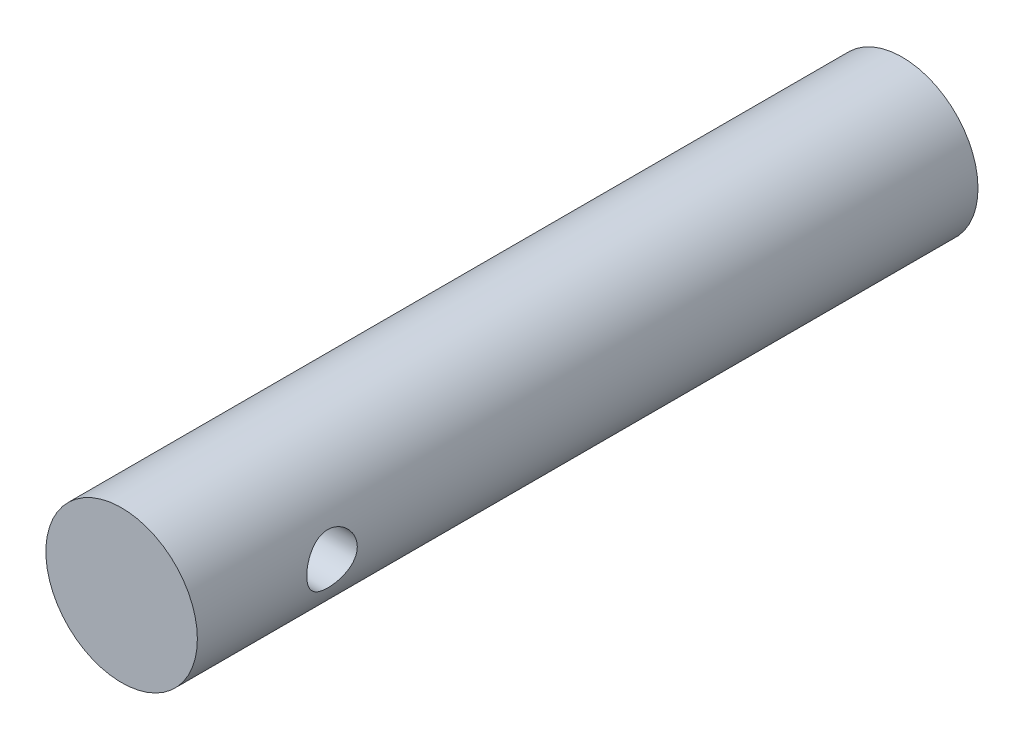
ISO-10303-21;
HEADER;
FILE_DESCRIPTION(('STEP AP214'),'2;1');
FILE_NAME('part.step','',(''),(''),'','','');
FILE_SCHEMA(('AUTOMOTIVE_DESIGN { 1 0 10303 214 1 1 1 1 }'));
ENDSEC;
DATA;
#1=APPLICATION_CONTEXT('core data for automotive mechanical design processes');
#2=APPLICATION_PROTOCOL_DEFINITION('international standard','automotive_design',2000,#1);
#3=PRODUCT_CONTEXT('',#1,'mechanical');
#4=PRODUCT('Part','Part','',(#3));
#5=PRODUCT_RELATED_PRODUCT_CATEGORY('part','',(#4));
#6=PRODUCT_DEFINITION_FORMATION('','',#4);
#7=PRODUCT_DEFINITION_CONTEXT('part definition',#1,'design');
#8=PRODUCT_DEFINITION('design','',#6,#7);
#9=PRODUCT_DEFINITION_SHAPE('','',#8);
#10=(LENGTH_UNIT() NAMED_UNIT(*) SI_UNIT(.MILLI.,.METRE.));
#11=(NAMED_UNIT(*) PLANE_ANGLE_UNIT() SI_UNIT($,.RADIAN.));
#12=(NAMED_UNIT(*) SI_UNIT($,.STERADIAN.) SOLID_ANGLE_UNIT());
#13=UNCERTAINTY_MEASURE_WITH_UNIT(LENGTH_MEASURE(1.E-05),#10,'distance_accuracy_value','');
#14=(GEOMETRIC_REPRESENTATION_CONTEXT(3) GLOBAL_UNCERTAINTY_ASSIGNED_CONTEXT((#13)) GLOBAL_UNIT_ASSIGNED_CONTEXT((#10,
#11,#12)) REPRESENTATION_CONTEXT('',''));
#15=CARTESIAN_POINT('',(0.,0.,0.));
#16=DIRECTION('',(0.,0.,1.));
#17=DIRECTION('',(1.,0.,0.));
#18=AXIS2_PLACEMENT_3D('',#15,#16,#17);
#19=CARTESIAN_POINT('',(0.,0.,-58.890916));
#20=DIRECTION('',(0.,0.,1.));
#21=DIRECTION('',(1.,0.,0.));
#22=AXIS2_PLACEMENT_3D('',#19,#20,#21);
#23=CYLINDRICAL_SURFACE('',#22,5.715);
#24=CARTESIAN_POINT('',(-5.715,0.,-12.065));
#25=CARTESIAN_POINT('',(-5.71500029148298,-0.103943206299207,-12.0650004833588));
#26=CARTESIAN_POINT('',(-5.71213810911873,-0.207883495595937,-12.0564650930276));
#27=CARTESIAN_POINT('',(-5.7010022543725,-0.412702554463011,-12.0226535477032));
#28=CARTESIAN_POINT('',(-5.69272802020101,-0.513581005066346,-11.9973756547773));
#29=CARTESIAN_POINT('',(-5.67166711561773,-0.709293964000881,-11.9310418413534));
#30=CARTESIAN_POINT('',(-5.65888799127276,-0.804138268312893,-11.8900122960151));
#31=CARTESIAN_POINT('',(-5.63012169091536,-0.98559925461414,-11.7934590657429));
#32=CARTESIAN_POINT('',(-5.61413388222117,-1.07221430900633,-11.73793252167));
#33=CARTESIAN_POINT('',(-5.58001349913925,-1.23775789091741,-11.6119418417441));
#34=CARTESIAN_POINT('',(-5.5618295506351,-1.31636204906827,-11.5410654987338));
#35=CARTESIAN_POINT('',(-5.52564899661846,-1.46081627959746,-11.387263570284));
#36=CARTESIAN_POINT('',(-5.50765243318496,-1.52666354335742,-11.3043353384612));
#37=CARTESIAN_POINT('',(-5.47331898369207,-1.64558651494407,-11.1258633555507));
#38=CARTESIAN_POINT('',(-5.45704469820186,-1.69824055491106,-11.0300254258103));
#39=CARTESIAN_POINT('',(-5.42877956822435,-1.78654495473705,-10.8302245400565));
#40=CARTESIAN_POINT('',(-5.41678741686221,-1.82220050352178,-10.726264074805));
#41=CARTESIAN_POINT('',(-5.39898532728164,-1.87427894417495,-10.5168575130488));
#42=CARTESIAN_POINT('',(-5.3929806244111,-1.89130961895771,-10.4115796178283));
#43=CARTESIAN_POINT('',(-5.38725725879212,-1.90755483995217,-10.199502548333));
#44=CARTESIAN_POINT('',(-5.38753665358301,-1.90677489155698,-10.092703854349));
#45=CARTESIAN_POINT('',(-5.39417923590583,-1.88789291655501,-9.88580071900414));
#46=CARTESIAN_POINT('',(-5.4002638222765,-1.87058410458312,-9.78561339243927));
#47=CARTESIAN_POINT('',(-5.4173753296527,-1.82042974022813,-9.58965553564898));
#48=CARTESIAN_POINT('',(-5.42840284238725,-1.78758232765751,-9.4938855357462));
#49=CARTESIAN_POINT('',(-5.45435620705029,-1.7067639056047,-9.30767871202824));
#50=CARTESIAN_POINT('',(-5.46934197835889,-1.65855786278733,-9.21735261148056));
#51=CARTESIAN_POINT('',(-5.50149824086759,-1.54855374750747,-9.04582091972713));
#52=CARTESIAN_POINT('',(-5.51866936250833,-1.48675174905342,-8.96461797319192));
#53=CARTESIAN_POINT('',(-5.55435762064547,-1.34750047875966,-8.80918050550374));
#54=CARTESIAN_POINT('',(-5.57289822720976,-1.26940275089537,-8.73553111696023));
#55=CARTESIAN_POINT('',(-5.60845217627305,-1.10173688079297,-8.60222193700623));
#56=CARTESIAN_POINT('',(-5.62546537220018,-1.01216763973385,-8.54256348729664));
#57=CARTESIAN_POINT('',(-5.65627090621497,-0.822860202853136,-8.4384585480522));
#58=CARTESIAN_POINT('',(-5.67002961765315,-0.723029941573117,-8.39416883899592));
#59=CARTESIAN_POINT('',(-5.69253180410148,-0.516767603809384,-8.32319295361438));
#60=CARTESIAN_POINT('',(-5.70127702112545,-0.410337834685184,-8.29650066231836));
#61=CARTESIAN_POINT('',(-5.71247829571094,-0.198851195253322,-8.26251395622742));
#62=CARTESIAN_POINT('',(-5.71519053493252,-0.0939347877425302,-8.25442886352592));
#63=CARTESIAN_POINT('',(-5.71478859633646,0.115776508274254,-8.25563374320509));
#64=CARTESIAN_POINT('',(-5.71167540198885,0.220571414303935,-8.26492078276168));
#65=CARTESIAN_POINT('',(-5.70014147086084,0.423900345309607,-8.29998068423701));
#66=CARTESIAN_POINT('',(-5.69187708544821,0.522527797020377,-8.3252682225243));
#67=CARTESIAN_POINT('',(-5.67102968211283,0.714100601094087,-8.39100451170913));
#68=CARTESIAN_POINT('',(-5.65844611348916,0.807045227108894,-8.43145519598614));
#69=CARTESIAN_POINT('',(-5.62982614102287,0.987339204629184,-8.52754917265671));
#70=CARTESIAN_POINT('',(-5.61370762109773,1.07447707230866,-8.58356410020445));
#71=CARTESIAN_POINT('',(-5.5798450871048,1.23837350140829,-8.70875985577569));
#72=CARTESIAN_POINT('',(-5.56210057746242,1.31512888065057,-8.77794470474052));
#73=CARTESIAN_POINT('',(-5.52596395402747,1.459711027371,-8.93123452066756));
#74=CARTESIAN_POINT('',(-5.5075790487155,1.52697364641319,-9.01587457729568));
#75=CARTESIAN_POINT('',(-5.4730644912642,1.64641058002641,-9.19563483667975));
#76=CARTESIAN_POINT('',(-5.45693485792714,1.69858476880857,-9.29075512679792));
#77=CARTESIAN_POINT('',(-5.42891456362586,1.78612215244316,-9.48881709412726));
#78=CARTESIAN_POINT('',(-5.41701534310625,1.82151934177436,-9.59174246081651));
#79=CARTESIAN_POINT('',(-5.39897635543786,1.87431934017657,-9.80258132833408));
#80=CARTESIAN_POINT('',(-5.39283399378033,1.89173025568725,-9.91049255909529));
#81=CARTESIAN_POINT('',(-5.38729921155308,1.90743131811933,-10.1222754679579));
#82=CARTESIAN_POINT('',(-5.38757622490376,1.90665784017249,-10.2260698582464));
#83=CARTESIAN_POINT('',(-5.39403169014468,1.88831656901975,-10.4319674677265));
#84=CARTESIAN_POINT('',(-5.40020979079634,1.8707497753686,-10.5340707872044));
#85=CARTESIAN_POINT('',(-5.41752518800819,1.8199833040114,-10.7317584380197));
#86=CARTESIAN_POINT('',(-5.4285660673282,1.78708687415955,-10.8274297516336));
#87=CARTESIAN_POINT('',(-5.45432739749183,1.70684069177231,-11.0119682102174));
#88=CARTESIAN_POINT('',(-5.46904866494264,1.65948773109499,-11.1008338394132));
#89=CARTESIAN_POINT('',(-5.50131289675618,1.54926161937143,-11.2734413912031));
#90=CARTESIAN_POINT('',(-5.51895095678271,1.48580140246652,-11.3567905361164));
#91=CARTESIAN_POINT('',(-5.55466293719597,1.3461546923734,-11.5119590944969));
#92=CARTESIAN_POINT('',(-5.57273697958069,1.26996460088007,-11.5837752366858));
#93=CARTESIAN_POINT('',(-5.60813008151162,1.1034551659339,-11.7166601054109));
#94=CARTESIAN_POINT('',(-5.62539226331394,1.01270088321698,-11.7772008824657));
#95=CARTESIAN_POINT('',(-5.65644013183826,0.821735765859615,-11.8821017669605));
#96=CARTESIAN_POINT('',(-5.67022670704606,0.721527357042119,-11.9264660109815));
#97=CARTESIAN_POINT('',(-5.69224506205572,0.519100397917855,-11.9958897098909));
#98=CARTESIAN_POINT('',(-5.70069749664906,0.417171678373555,-12.0217230982317));
#99=CARTESIAN_POINT('',(-5.71207405457342,0.210160392499519,-12.0562756346899));
#100=CARTESIAN_POINT('',(-5.71499970533279,0.105078705708461,-12.0649995113609));
#101=CARTESIAN_POINT('',(-5.715,0.,-12.065));
#102=B_SPLINE_CURVE_WITH_KNOTS('',3,(#24,#25,#26,#27,#28,#29,#30,#31,#32,#33,#34,#35,#36,#37,
#38,#39,#40,#41,#42,#43,#44,#45,#46,#47,#48,#49,#50,#51,#52,#53,#54,#55,#56,#57,#58,#59,#60,#61,
#62,#63,#64,#65,#66,#67,#68,#69,#70,#71,#72,#73,#74,#75,#76,#77,#78,#79,#80,#81,#82,#83,#84,#85,
#86,#87,#88,#89,#90,#91,#92,#93,#94,#95,#96,#97,#98,#99,#100,#101),.UNSPECIFIED.,.T.,.F.,(4,2,2,
2,2,2,2,2,2,2,2,2,2,2,2,2,2,2,2,2,2,2,2,2,2,2,2,2,2,2,2,2,2,2,2,2,2,2,4),(0.,0.31144293697955,
0.622918207934625,0.933874191817869,1.24489154970728,1.5656182355865,1.88641545412744,
2.2164367308871,2.54635720139847,2.86515668538204,3.18385762746159,3.48799454580188,
3.79216788279692,4.10123966050522,4.41040080373383,4.73570247570652,5.06103533066406,
5.38959562763929,5.7180416921108,6.03225075948696,6.34640678577754,6.65146290948494,
6.95655794266215,7.26967811702316,7.582894044657,7.9103414858783,8.23779165687666,
8.56457546339995,8.89121192364622,9.20106743852409,9.51090451164367,9.81485693388192,
10.1188768572523,10.4361627704788,10.7535385219079,11.0832835389086,11.4129441759543,
11.7278764370211,12.0427216480265),.UNSPECIFIED.);
#103=CARTESIAN_POINT('',(-5.715,0.,-12.065));
#104=VERTEX_POINT('',#103);
#105=EDGE_CURVE('E10',#104,#104,#102,.T.);
#106=ORIENTED_EDGE('',*,*,#105,.F.);
#107=EDGE_LOOP('',(#106));
#108=FACE_BOUND('',#107,.T.);
#109=CARTESIAN_POINT('',(5.715,0.,-12.065));
#110=CARTESIAN_POINT('',(5.71500029148298,0.103943206299207,-12.0650004833588));
#111=CARTESIAN_POINT('',(5.71213810911873,0.207883495595937,-12.0564650930276));
#112=CARTESIAN_POINT('',(5.7010022543725,0.412702554463011,-12.0226535477032));
#113=CARTESIAN_POINT('',(5.69272802020101,0.513581005066346,-11.9973756547773));
#114=CARTESIAN_POINT('',(5.67166711561773,0.709293964000881,-11.9310418413534));
#115=CARTESIAN_POINT('',(5.65888799127276,0.804138268312893,-11.8900122960151));
#116=CARTESIAN_POINT('',(5.63012169091536,0.98559925461414,-11.7934590657429));
#117=CARTESIAN_POINT('',(5.61413388222117,1.07221430900633,-11.73793252167));
#118=CARTESIAN_POINT('',(5.58001349913925,1.23775789091741,-11.6119418417441));
#119=CARTESIAN_POINT('',(5.5618295506351,1.31636204906827,-11.5410654987338));
#120=CARTESIAN_POINT('',(5.52564899661846,1.46081627959746,-11.387263570284));
#121=CARTESIAN_POINT('',(5.50765243318496,1.52666354335742,-11.3043353384612));
#122=CARTESIAN_POINT('',(5.47331898369207,1.64558651494407,-11.1258633555507));
#123=CARTESIAN_POINT('',(5.45704469820186,1.69824055491106,-11.0300254258103));
#124=CARTESIAN_POINT('',(5.42877956822435,1.78654495473705,-10.8302245400565));
#125=CARTESIAN_POINT('',(5.41678741686221,1.82220050352178,-10.726264074805));
#126=CARTESIAN_POINT('',(5.39898532728164,1.87427894417495,-10.5168575130488));
#127=CARTESIAN_POINT('',(5.3929806244111,1.89130961895771,-10.4115796178283));
#128=CARTESIAN_POINT('',(5.38725725879212,1.90755483995217,-10.199502548333));
#129=CARTESIAN_POINT('',(5.38753665358301,1.90677489155698,-10.092703854349));
#130=CARTESIAN_POINT('',(5.39417923590583,1.88789291655501,-9.88580071900414));
#131=CARTESIAN_POINT('',(5.4002638222765,1.87058410458312,-9.78561339243927));
#132=CARTESIAN_POINT('',(5.4173753296527,1.82042974022813,-9.58965553564898));
#133=CARTESIAN_POINT('',(5.42840284238725,1.78758232765751,-9.4938855357462));
#134=CARTESIAN_POINT('',(5.45435620705029,1.7067639056047,-9.30767871202824));
#135=CARTESIAN_POINT('',(5.46934197835889,1.65855786278733,-9.21735261148056));
#136=CARTESIAN_POINT('',(5.50149824086759,1.54855374750747,-9.04582091972713));
#137=CARTESIAN_POINT('',(5.51866936250833,1.48675174905342,-8.96461797319192));
#138=CARTESIAN_POINT('',(5.55435762064547,1.34750047875966,-8.80918050550374));
#139=CARTESIAN_POINT('',(5.57289822720976,1.26940275089537,-8.73553111696023));
#140=CARTESIAN_POINT('',(5.60845217627305,1.10173688079297,-8.60222193700623));
#141=CARTESIAN_POINT('',(5.62546537220018,1.01216763973385,-8.54256348729664));
#142=CARTESIAN_POINT('',(5.65627090621497,0.822860202853136,-8.4384585480522));
#143=CARTESIAN_POINT('',(5.67002961765315,0.723029941573117,-8.39416883899592));
#144=CARTESIAN_POINT('',(5.69253180410148,0.516767603809384,-8.32319295361438));
#145=CARTESIAN_POINT('',(5.70127702112545,0.410337834685184,-8.29650066231836));
#146=CARTESIAN_POINT('',(5.71247829571094,0.198851195253322,-8.26251395622742));
#147=CARTESIAN_POINT('',(5.71519053493252,0.0939347877425302,-8.25442886352592));
#148=CARTESIAN_POINT('',(5.71478859633646,-0.115776508274254,-8.25563374320509));
#149=CARTESIAN_POINT('',(5.71167540198885,-0.220571414303935,-8.26492078276168));
#150=CARTESIAN_POINT('',(5.70014147086084,-0.423900345309607,-8.29998068423701));
#151=CARTESIAN_POINT('',(5.69187708544821,-0.522527797020377,-8.3252682225243));
#152=CARTESIAN_POINT('',(5.67102968211283,-0.714100601094087,-8.39100451170913));
#153=CARTESIAN_POINT('',(5.65844611348916,-0.807045227108894,-8.43145519598614));
#154=CARTESIAN_POINT('',(5.62982614102287,-0.987339204629184,-8.52754917265671));
#155=CARTESIAN_POINT('',(5.61370762109773,-1.07447707230866,-8.58356410020445));
#156=CARTESIAN_POINT('',(5.5798450871048,-1.23837350140829,-8.70875985577569));
#157=CARTESIAN_POINT('',(5.56210057746242,-1.31512888065057,-8.77794470474052));
#158=CARTESIAN_POINT('',(5.52596395402747,-1.459711027371,-8.93123452066756));
#159=CARTESIAN_POINT('',(5.5075790487155,-1.52697364641319,-9.01587457729568));
#160=CARTESIAN_POINT('',(5.4730644912642,-1.64641058002641,-9.19563483667975));
#161=CARTESIAN_POINT('',(5.45693485792714,-1.69858476880857,-9.29075512679792));
#162=CARTESIAN_POINT('',(5.42891456362586,-1.78612215244316,-9.48881709412726));
#163=CARTESIAN_POINT('',(5.41701534310625,-1.82151934177436,-9.59174246081651));
#164=CARTESIAN_POINT('',(5.39897635543786,-1.87431934017657,-9.80258132833408));
#165=CARTESIAN_POINT('',(5.39283399378033,-1.89173025568725,-9.91049255909529));
#166=CARTESIAN_POINT('',(5.38729921155308,-1.90743131811933,-10.1222754679579));
#167=CARTESIAN_POINT('',(5.38757622490376,-1.90665784017249,-10.2260698582464));
#168=CARTESIAN_POINT('',(5.39403169014468,-1.88831656901975,-10.4319674677265));
#169=CARTESIAN_POINT('',(5.40020979079634,-1.8707497753686,-10.5340707872044));
#170=CARTESIAN_POINT('',(5.41752518800819,-1.8199833040114,-10.7317584380197));
#171=CARTESIAN_POINT('',(5.4285660673282,-1.78708687415955,-10.8274297516336));
#172=CARTESIAN_POINT('',(5.45432739749183,-1.70684069177231,-11.0119682102174));
#173=CARTESIAN_POINT('',(5.46904866494264,-1.65948773109499,-11.1008338394132));
#174=CARTESIAN_POINT('',(5.50131289675618,-1.54926161937143,-11.2734413912031));
#175=CARTESIAN_POINT('',(5.51895095678271,-1.48580140246652,-11.3567905361164));
#176=CARTESIAN_POINT('',(5.55466293719597,-1.3461546923734,-11.5119590944969));
#177=CARTESIAN_POINT('',(5.57273697958069,-1.26996460088007,-11.5837752366858));
#178=CARTESIAN_POINT('',(5.60813008151162,-1.1034551659339,-11.7166601054109));
#179=CARTESIAN_POINT('',(5.62539226331394,-1.01270088321698,-11.7772008824657));
#180=CARTESIAN_POINT('',(5.65644013183826,-0.821735765859615,-11.8821017669605));
#181=CARTESIAN_POINT('',(5.67022670704606,-0.721527357042119,-11.9264660109815));
#182=CARTESIAN_POINT('',(5.69224506205572,-0.519100397917855,-11.9958897098909));
#183=CARTESIAN_POINT('',(5.70069749664906,-0.417171678373555,-12.0217230982317));
#184=CARTESIAN_POINT('',(5.71207405457342,-0.210160392499519,-12.0562756346899));
#185=CARTESIAN_POINT('',(5.71499970533279,-0.105078705708461,-12.0649995113609));
#186=CARTESIAN_POINT('',(5.715,0.,-12.065));
#187=B_SPLINE_CURVE_WITH_KNOTS('',3,(#109,#110,#111,#112,#113,#114,#115,#116,#117,#118,#119,
#120,#121,#122,#123,#124,#125,#126,#127,#128,#129,#130,#131,#132,#133,#134,#135,#136,#137,#138,
#139,#140,#141,#142,#143,#144,#145,#146,#147,#148,#149,#150,#151,#152,#153,#154,#155,#156,#157,
#158,#159,#160,#161,#162,#163,#164,#165,#166,#167,#168,#169,#170,#171,#172,#173,#174,#175,#176,
#177,#178,#179,#180,#181,#182,#183,#184,#185,#186),.UNSPECIFIED.,.T.,.F.,(4,2,2,2,2,2,2,2,2,2,2,
2,2,2,2,2,2,2,2,2,2,2,2,2,2,2,2,2,2,2,2,2,2,2,2,2,2,2,4),(0.,0.31144293697955,0.622918207934625,
0.933874191817869,1.24489154970728,1.5656182355865,1.88641545412744,2.2164367308871,
2.54635720139847,2.86515668538204,3.18385762746159,3.48799454580188,3.79216788279692,
4.10123966050522,4.41040080373383,4.73570247570652,5.06103533066406,5.38959562763929,
5.7180416921108,6.03225075948696,6.34640678577754,6.65146290948494,6.95655794266215,
7.26967811702316,7.582894044657,7.9103414858783,8.23779165687666,8.56457546339995,
8.89121192364622,9.20106743852409,9.51090451164367,9.81485693388192,10.1188768572523,
10.4361627704788,10.7535385219079,11.0832835389086,11.4129441759543,11.7278764370211,
12.0427216480265),.UNSPECIFIED.);
#188=CARTESIAN_POINT('',(5.715,0.,-12.065));
#189=VERTEX_POINT('',#188);
#190=EDGE_CURVE('E50',#189,#189,#187,.T.);
#191=ORIENTED_EDGE('',*,*,#190,.F.);
#192=EDGE_LOOP('',(#191));
#193=FACE_BOUND('',#192,.T.);
#194=CARTESIAN_POINT('',(0.,0.,-58.890916));
#195=DIRECTION('',(0.,0.,1.));
#196=DIRECTION('',(1.,0.,0.));
#197=AXIS2_PLACEMENT_3D('',#194,#195,#196);
#198=CIRCLE('',#197,5.715);
#199=CARTESIAN_POINT('',(5.715,0.,-58.890916));
#200=VERTEX_POINT('',#199);
#201=EDGE_CURVE('E54',#200,#200,#198,.T.);
#202=ORIENTED_EDGE('',*,*,#201,.T.);
#203=EDGE_LOOP('',(#202));
#204=FACE_BOUND('',#203,.T.);
#205=CARTESIAN_POINT('',(0.,0.,0.));
#206=DIRECTION('',(0.,0.,1.));
#207=DIRECTION('',(1.,0.,0.));
#208=AXIS2_PLACEMENT_3D('',#205,#206,#207);
#209=CIRCLE('',#208,5.715);
#210=CARTESIAN_POINT('',(5.715,0.,0.));
#211=VERTEX_POINT('',#210);
#212=EDGE_CURVE('E59',#211,#211,#209,.T.);
#213=ORIENTED_EDGE('',*,*,#212,.F.);
#214=EDGE_LOOP('',(#213));
#215=FACE_BOUND('',#214,.T.);
#216=ADVANCED_FACE('F39',(#108,#193,#204,#215),#23,.T.);
#217=CARTESIAN_POINT('',(0.,0.,-58.890916));
#218=DIRECTION('',(0.,0.,1.));
#219=DIRECTION('',(1.,0.,0.));
#220=AXIS2_PLACEMENT_3D('',#217,#218,#219);
#221=PLANE('',#220);
#222=ORIENTED_EDGE('',*,*,#201,.F.);
#223=EDGE_LOOP('',(#222));
#224=FACE_BOUND('',#223,.T.);
#225=ADVANCED_FACE('F70',(#224),#221,.F.);
#226=CARTESIAN_POINT('',(0.,0.,0.));
#227=DIRECTION('',(0.,0.,1.));
#228=DIRECTION('',(1.,0.,0.));
#229=AXIS2_PLACEMENT_3D('',#226,#227,#228);
#230=PLANE('',#229);
#231=ORIENTED_EDGE('',*,*,#212,.T.);
#232=EDGE_LOOP('',(#231));
#233=FACE_BOUND('',#232,.T.);
#234=ADVANCED_FACE('F69',(#233),#230,.T.);
#235=CARTESIAN_POINT('',(-5.715,0.,-10.16));
#236=DIRECTION('',(1.,0.,0.));
#237=DIRECTION('',(0.,0.,-1.));
#238=AXIS2_PLACEMENT_3D('',#235,#236,#237);
#239=CYLINDRICAL_SURFACE('',#238,1.90499999999999);
#240=ORIENTED_EDGE('',*,*,#105,.T.);
#241=EDGE_LOOP('',(#240));
#242=FACE_BOUND('',#241,.T.);
#243=ORIENTED_EDGE('',*,*,#190,.T.);
#244=EDGE_LOOP('',(#243));
#245=FACE_BOUND('',#244,.T.);
#246=ADVANCED_FACE('F65',(#242,#245),#239,.F.);
#247=CLOSED_SHELL('',(#216,#225,#234,#246));
#248=MANIFOLD_SOLID_BREP('B2',#247);
#249=ADVANCED_BREP_SHAPE_REPRESENTATION('',(#18,#248),#14);
#250=SHAPE_DEFINITION_REPRESENTATION(#9,#249);
ENDSEC;
END-ISO-10303-21;
